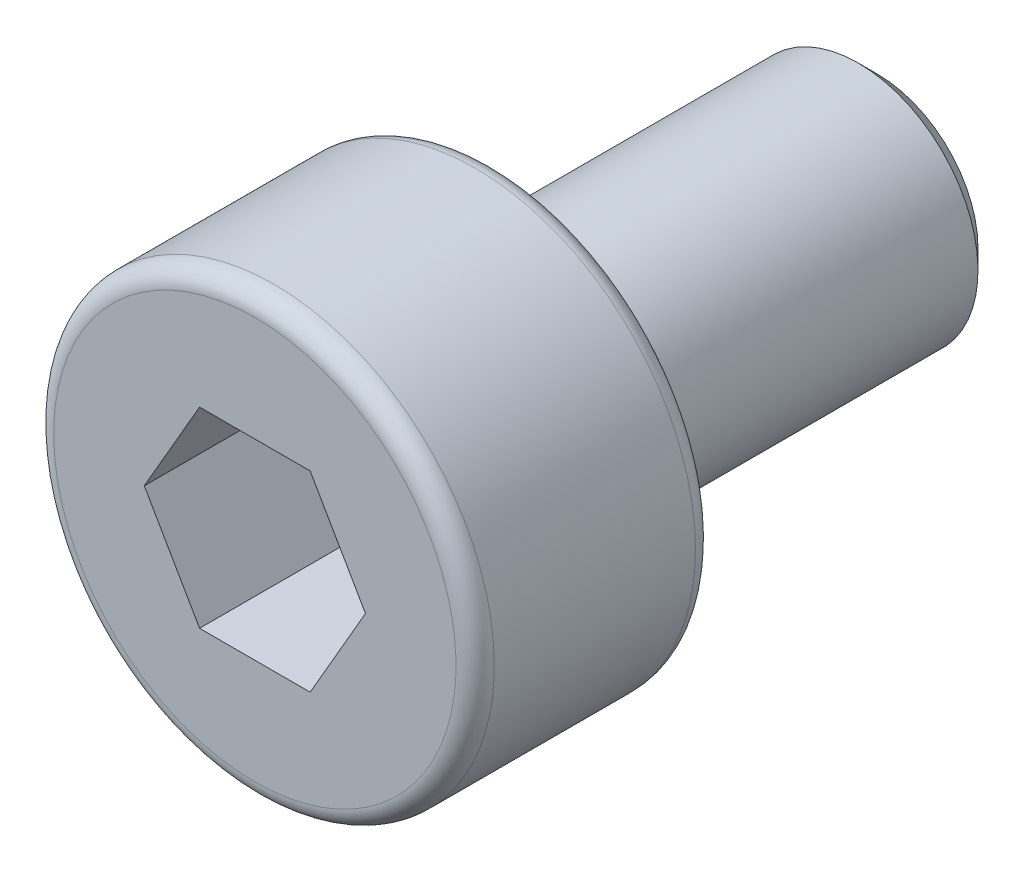
ISO-10303-21;
HEADER;
FILE_DESCRIPTION(('STEP AP214'),'2;1');
FILE_NAME('part.step','',(''),(''),'','','');
FILE_SCHEMA(('AUTOMOTIVE_DESIGN { 1 0 10303 214 1 1 1 1 }'));
ENDSEC;
DATA;
#1=APPLICATION_CONTEXT('core data for automotive mechanical design processes');
#2=APPLICATION_PROTOCOL_DEFINITION('international standard','automotive_design',2000,#1);
#3=PRODUCT_CONTEXT('',#1,'mechanical');
#4=PRODUCT('Part','Part','',(#3));
#5=PRODUCT_RELATED_PRODUCT_CATEGORY('part','',(#4));
#6=PRODUCT_DEFINITION_FORMATION('','',#4);
#7=PRODUCT_DEFINITION_CONTEXT('part definition',#1,'design');
#8=PRODUCT_DEFINITION('design','',#6,#7);
#9=PRODUCT_DEFINITION_SHAPE('','',#8);
#10=(LENGTH_UNIT() NAMED_UNIT(*) SI_UNIT(.MILLI.,.METRE.));
#11=(NAMED_UNIT(*) PLANE_ANGLE_UNIT() SI_UNIT($,.RADIAN.));
#12=(NAMED_UNIT(*) SI_UNIT($,.STERADIAN.) SOLID_ANGLE_UNIT());
#13=UNCERTAINTY_MEASURE_WITH_UNIT(LENGTH_MEASURE(1.E-05),#10,'distance_accuracy_value','');
#14=(GEOMETRIC_REPRESENTATION_CONTEXT(3) GLOBAL_UNCERTAINTY_ASSIGNED_CONTEXT((#13)) GLOBAL_UNIT_ASSIGNED_CONTEXT((#10,
#11,#12)) REPRESENTATION_CONTEXT('',''));
#15=CARTESIAN_POINT('',(0.,0.,0.));
#16=DIRECTION('',(0.,0.,1.));
#17=DIRECTION('',(1.,0.,0.));
#18=AXIS2_PLACEMENT_3D('',#15,#16,#17);
#19=CARTESIAN_POINT('',(0.,0.,0.));
#20=DIRECTION('',(0.,0.,1.));
#21=DIRECTION('',(0.,-1.,0.));
#22=AXIS2_PLACEMENT_3D('',#19,#20,#21);
#23=PLANE('',#22);
#24=DIRECTION('',(0.5,0.866025403784439,0.));
#25=VECTOR('',#24,1.);
#26=CARTESIAN_POINT('',(0.577350269189626,-1.,0.));
#27=LINE('',#26,#25);
#28=CARTESIAN_POINT('',(0.577350269189626,-1.,0.));
#29=VERTEX_POINT('',#28);
#30=CARTESIAN_POINT('',(1.15470053837925,0.,0.));
#31=VERTEX_POINT('',#30);
#32=EDGE_CURVE('E50',#29,#31,#27,.T.);
#33=ORIENTED_EDGE('',*,*,#32,.F.);
#34=DIRECTION('',(1.,0.,0.));
#35=VECTOR('',#34,1.);
#36=CARTESIAN_POINT('',(-0.577350269189626,-1.,0.));
#37=LINE('',#36,#35);
#38=CARTESIAN_POINT('',(-0.577350269189626,-1.,0.));
#39=VERTEX_POINT('',#38);
#40=EDGE_CURVE('E133',#39,#29,#37,.T.);
#41=ORIENTED_EDGE('',*,*,#40,.F.);
#42=DIRECTION('',(0.5,-0.866025403784438,0.));
#43=VECTOR('',#42,1.);
#44=CARTESIAN_POINT('',(-1.15470053837925,0.,0.));
#45=LINE('',#44,#43);
#46=CARTESIAN_POINT('',(-1.15470053837925,0.,0.));
#47=VERTEX_POINT('',#46);
#48=EDGE_CURVE('E131',#47,#39,#45,.T.);
#49=ORIENTED_EDGE('',*,*,#48,.F.);
#50=DIRECTION('',(-0.5,-0.866025403784439,0.));
#51=VECTOR('',#50,1.);
#52=CARTESIAN_POINT('',(-0.577350269189626,1.,0.));
#53=LINE('',#52,#51);
#54=CARTESIAN_POINT('',(-0.577350269189626,1.,0.));
#55=VERTEX_POINT('',#54);
#56=EDGE_CURVE('E98',#55,#47,#53,.T.);
#57=ORIENTED_EDGE('',*,*,#56,.F.);
#58=DIRECTION('',(-1.,0.,0.));
#59=VECTOR('',#58,1.);
#60=CARTESIAN_POINT('',(0.577350269189625,1.,0.));
#61=LINE('',#60,#59);
#62=CARTESIAN_POINT('',(0.577350269189625,1.,0.));
#63=VERTEX_POINT('',#62);
#64=EDGE_CURVE('E127',#63,#55,#61,.T.);
#65=ORIENTED_EDGE('',*,*,#64,.F.);
#66=DIRECTION('',(-0.5,0.866025403784438,0.));
#67=VECTOR('',#66,1.);
#68=CARTESIAN_POINT('',(1.15470053837925,0.,0.));
#69=LINE('',#68,#67);
#70=EDGE_CURVE('E124',#31,#63,#69,.T.);
#71=ORIENTED_EDGE('',*,*,#70,.F.);
#72=EDGE_LOOP('',(#33,#41,#49,#57,#65,#71));
#73=FACE_BOUND('',#72,.T.);
#74=CARTESIAN_POINT('',(0.,0.,0.));
#75=DIRECTION('',(0.,0.,1.));
#76=DIRECTION('',(0.,-1.,0.));
#77=AXIS2_PLACEMENT_3D('',#74,#75,#76);
#78=CIRCLE('',#77,2.1);
#79=CARTESIAN_POINT('',(0.,-2.1,0.));
#80=VERTEX_POINT('',#79);
#81=EDGE_CURVE('E154',#80,#80,#78,.T.);
#82=ORIENTED_EDGE('',*,*,#81,.T.);
#83=EDGE_LOOP('',(#82));
#84=FACE_BOUND('',#83,.T.);
#85=ADVANCED_FACE('F34',(#73,#84),#23,.T.);
#86=CARTESIAN_POINT('',(0.,0.,-6.5));
#87=DIRECTION('',(0.,0.,-1.));
#88=DIRECTION('',(0.,1.,0.));
#89=AXIS2_PLACEMENT_3D('',#86,#87,#88);
#90=CYLINDRICAL_SURFACE('',#89,2.3);
#91=CARTESIAN_POINT('',(0.,0.,-2.3));
#92=DIRECTION('',(0.,0.,-1.));
#93=DIRECTION('',(0.,1.,0.));
#94=AXIS2_PLACEMENT_3D('',#91,#92,#93);
#95=CIRCLE('',#94,2.3);
#96=CARTESIAN_POINT('',(0.,2.3,-2.3));
#97=VERTEX_POINT('',#96);
#98=EDGE_CURVE('E151',#97,#97,#95,.F.);
#99=ORIENTED_EDGE('',*,*,#98,.T.);
#100=EDGE_LOOP('',(#99));
#101=FACE_BOUND('',#100,.T.);
#102=CARTESIAN_POINT('',(0.,0.,-0.2));
#103=DIRECTION('',(0.,0.,1.));
#104=DIRECTION('',(0.,-1.,0.));
#105=AXIS2_PLACEMENT_3D('',#102,#103,#104);
#106=CIRCLE('',#105,2.3);
#107=CARTESIAN_POINT('',(0.,-2.3,-0.2));
#108=VERTEX_POINT('',#107);
#109=EDGE_CURVE('E148',#108,#108,#106,.F.);
#110=ORIENTED_EDGE('',*,*,#109,.T.);
#111=EDGE_LOOP('',(#110));
#112=FACE_BOUND('',#111,.T.);
#113=ADVANCED_FACE('F175',(#101,#112),#90,.T.);
#114=CARTESIAN_POINT('',(0.,2.3,-2.5));
#115=DIRECTION('',(0.,0.,-1.));
#116=DIRECTION('',(0.,1.,0.));
#117=AXIS2_PLACEMENT_3D('',#114,#115,#116);
#118=PLANE('',#117);
#119=CARTESIAN_POINT('',(0.,0.,-2.5));
#120=DIRECTION('',(0.,0.,-1.));
#121=DIRECTION('',(0.,1.,0.));
#122=AXIS2_PLACEMENT_3D('',#119,#120,#121);
#123=CIRCLE('',#122,2.1);
#124=CARTESIAN_POINT('',(0.,2.1,-2.5));
#125=VERTEX_POINT('',#124);
#126=EDGE_CURVE('E145',#125,#125,#123,.T.);
#127=ORIENTED_EDGE('',*,*,#126,.T.);
#128=EDGE_LOOP('',(#127));
#129=FACE_BOUND('',#128,.T.);
#130=CARTESIAN_POINT('',(0.,0.,-2.5));
#131=DIRECTION('',(0.,0.,-1.));
#132=DIRECTION('',(0.,1.,0.));
#133=AXIS2_PLACEMENT_3D('',#130,#131,#132);
#134=CIRCLE('',#133,1.25);
#135=CARTESIAN_POINT('',(0.,1.25,-2.5));
#136=VERTEX_POINT('',#135);
#137=EDGE_CURVE('E137',#136,#136,#134,.T.);
#138=ORIENTED_EDGE('',*,*,#137,.F.);
#139=EDGE_LOOP('',(#138));
#140=FACE_BOUND('',#139,.T.);
#141=ADVANCED_FACE('F181',(#129,#140),#118,.T.);
#142=CARTESIAN_POINT('',(0.,0.,-6.5));
#143=DIRECTION('',(0.,0.,-1.));
#144=DIRECTION('',(0.,1.,0.));
#145=AXIS2_PLACEMENT_3D('',#142,#143,#144);
#146=CYLINDRICAL_SURFACE('',#145,1.25);
#147=CARTESIAN_POINT('',(0.,0.,-6.3));
#148=DIRECTION('',(0.,0.,-1.));
#149=DIRECTION('',(0.,1.,0.));
#150=AXIS2_PLACEMENT_3D('',#147,#148,#149);
#151=CIRCLE('',#150,1.25);
#152=CARTESIAN_POINT('',(0.,1.25,-6.3));
#153=VERTEX_POINT('',#152);
#154=EDGE_CURVE('E11',#153,#153,#151,.F.);
#155=ORIENTED_EDGE('',*,*,#154,.T.);
#156=EDGE_LOOP('',(#155));
#157=FACE_BOUND('',#156,.T.);
#158=ORIENTED_EDGE('',*,*,#137,.T.);
#159=EDGE_LOOP('',(#158));
#160=FACE_BOUND('',#159,.T.);
#161=ADVANCED_FACE('F192',(#157,#160),#146,.T.);
#162=CARTESIAN_POINT('',(0.,1.25,-6.5));
#163=DIRECTION('',(0.,0.,-1.));
#164=DIRECTION('',(0.,1.,0.));
#165=AXIS2_PLACEMENT_3D('',#162,#163,#164);
#166=PLANE('',#165);
#167=CARTESIAN_POINT('',(0.,0.,-6.5));
#168=DIRECTION('',(0.,0.,-1.));
#169=DIRECTION('',(0.,1.,0.));
#170=AXIS2_PLACEMENT_3D('',#167,#168,#169);
#171=CIRCLE('',#170,1.05);
#172=CARTESIAN_POINT('',(0.,1.05,-6.5));
#173=VERTEX_POINT('',#172);
#174=EDGE_CURVE('E43',#173,#173,#171,.T.);
#175=ORIENTED_EDGE('',*,*,#174,.T.);
#176=EDGE_LOOP('',(#175));
#177=FACE_BOUND('',#176,.T.);
#178=ADVANCED_FACE('F159',(#177),#166,.T.);
#179=CARTESIAN_POINT('',(0.,0.,-2.3));
#180=DIRECTION('',(0.,0.,-1.));
#181=DIRECTION('',(0.,1.,0.));
#182=AXIS2_PLACEMENT_3D('',#179,#180,#181);
#183=TOROIDAL_SURFACE('',#182,2.1,0.2);
#184=ORIENTED_EDGE('',*,*,#98,.F.);
#185=EDGE_LOOP('',(#184));
#186=FACE_BOUND('',#185,.T.);
#187=ORIENTED_EDGE('',*,*,#126,.F.);
#188=EDGE_LOOP('',(#187));
#189=FACE_BOUND('',#188,.T.);
#190=ADVANCED_FACE('F171',(#186,#189),#183,.T.);
#191=CARTESIAN_POINT('',(0.,0.,-0.2));
#192=DIRECTION('',(0.,0.,1.));
#193=DIRECTION('',(0.,-1.,0.));
#194=AXIS2_PLACEMENT_3D('',#191,#192,#193);
#195=TOROIDAL_SURFACE('',#194,2.1,0.2);
#196=ORIENTED_EDGE('',*,*,#81,.F.);
#197=EDGE_LOOP('',(#196));
#198=FACE_BOUND('',#197,.T.);
#199=ORIENTED_EDGE('',*,*,#109,.F.);
#200=EDGE_LOOP('',(#199));
#201=FACE_BOUND('',#200,.T.);
#202=ADVANCED_FACE('F163',(#198,#201),#195,.T.);
#203=CARTESIAN_POINT('',(0.,0.,-6.5));
#204=DIRECTION('',(0.,0.,1.));
#205=DIRECTION('',(0.,-1.,0.));
#206=AXIS2_PLACEMENT_3D('',#203,#204,#205);
#207=CONICAL_SURFACE('',#206,1.05,0.785398163397446);
#208=ORIENTED_EDGE('',*,*,#154,.F.);
#209=EDGE_LOOP('',(#208));
#210=FACE_BOUND('',#209,.T.);
#211=ORIENTED_EDGE('',*,*,#174,.F.);
#212=EDGE_LOOP('',(#211));
#213=FACE_BOUND('',#212,.T.);
#214=ADVANCED_FACE('F37',(#210,#213),#207,.T.);
#215=CARTESIAN_POINT('',(0.577350269189626,-1.,-1.5));
#216=DIRECTION('',(0.866025403784439,-0.5,0.));
#217=DIRECTION('',(0.5,0.866025403784439,0.));
#218=AXIS2_PLACEMENT_3D('',#215,#216,#217);
#219=PLANE('',#218);
#220=ORIENTED_EDGE('',*,*,#32,.T.);
#221=DIRECTION('',(0.,0.,1.));
#222=VECTOR('',#221,1.);
#223=CARTESIAN_POINT('',(1.15470053837925,0.,-1.5));
#224=LINE('',#223,#222);
#225=CARTESIAN_POINT('',(1.15470053837925,0.,-1.5));
#226=VERTEX_POINT('',#225);
#227=EDGE_CURVE('E80',#226,#31,#224,.T.);
#228=ORIENTED_EDGE('',*,*,#227,.F.);
#229=DIRECTION('',(0.5,0.866025403784439,0.));
#230=VECTOR('',#229,1.);
#231=CARTESIAN_POINT('',(0.577350269189626,-1.,-1.5));
#232=LINE('',#231,#230);
#233=CARTESIAN_POINT('',(0.577350269189626,-1.,-1.5));
#234=VERTEX_POINT('',#233);
#235=EDGE_CURVE('E135',#234,#226,#232,.T.);
#236=ORIENTED_EDGE('',*,*,#235,.F.);
#237=DIRECTION('',(0.,0.,1.));
#238=VECTOR('',#237,1.);
#239=CARTESIAN_POINT('',(0.577350269189626,-1.,-1.5));
#240=LINE('',#239,#238);
#241=EDGE_CURVE('E58',#234,#29,#240,.T.);
#242=ORIENTED_EDGE('',*,*,#241,.T.);
#243=EDGE_LOOP('',(#220,#228,#236,#242));
#244=FACE_BOUND('',#243,.T.);
#245=ADVANCED_FACE('F162',(#244),#219,.F.);
#246=CARTESIAN_POINT('',(-0.577350269189626,-1.,-1.5));
#247=DIRECTION('',(0.,-1.,0.));
#248=DIRECTION('',(0.,0.,-1.));
#249=AXIS2_PLACEMENT_3D('',#246,#247,#248);
#250=PLANE('',#249);
#251=ORIENTED_EDGE('',*,*,#40,.T.);
#252=ORIENTED_EDGE('',*,*,#241,.F.);
#253=DIRECTION('',(1.,0.,0.));
#254=VECTOR('',#253,1.);
#255=CARTESIAN_POINT('',(-0.577350269189626,-1.,-1.5));
#256=LINE('',#255,#254);
#257=CARTESIAN_POINT('',(-0.577350269189626,-1.,-1.5));
#258=VERTEX_POINT('',#257);
#259=EDGE_CURVE('E110',#258,#234,#256,.T.);
#260=ORIENTED_EDGE('',*,*,#259,.F.);
#261=DIRECTION('',(0.,0.,1.));
#262=VECTOR('',#261,1.);
#263=CARTESIAN_POINT('',(-0.577350269189626,-1.,-1.5));
#264=LINE('',#263,#262);
#265=EDGE_CURVE('E102',#258,#39,#264,.T.);
#266=ORIENTED_EDGE('',*,*,#265,.T.);
#267=EDGE_LOOP('',(#251,#252,#260,#266));
#268=FACE_BOUND('',#267,.T.);
#269=ADVANCED_FACE('F169',(#268),#250,.F.);
#270=CARTESIAN_POINT('',(-1.15470053837925,0.,-1.5));
#271=DIRECTION('',(-0.866025403784438,-0.5,0.));
#272=DIRECTION('',(0.5,-0.866025403784438,0.));
#273=AXIS2_PLACEMENT_3D('',#270,#271,#272);
#274=PLANE('',#273);
#275=ORIENTED_EDGE('',*,*,#48,.T.);
#276=ORIENTED_EDGE('',*,*,#265,.F.);
#277=DIRECTION('',(0.5,-0.866025403784438,0.));
#278=VECTOR('',#277,1.);
#279=CARTESIAN_POINT('',(-1.15470053837925,0.,-1.5));
#280=LINE('',#279,#278);
#281=CARTESIAN_POINT('',(-1.15470053837925,0.,-1.5));
#282=VERTEX_POINT('',#281);
#283=EDGE_CURVE('E106',#282,#258,#280,.T.);
#284=ORIENTED_EDGE('',*,*,#283,.F.);
#285=DIRECTION('',(0.,0.,1.));
#286=VECTOR('',#285,1.);
#287=CARTESIAN_POINT('',(-1.15470053837925,0.,-1.5));
#288=LINE('',#287,#286);
#289=EDGE_CURVE('E91',#282,#47,#288,.T.);
#290=ORIENTED_EDGE('',*,*,#289,.T.);
#291=EDGE_LOOP('',(#275,#276,#284,#290));
#292=FACE_BOUND('',#291,.T.);
#293=ADVANCED_FACE('F107',(#292),#274,.F.);
#294=CARTESIAN_POINT('',(-0.577350269189626,1.,-1.5));
#295=DIRECTION('',(-0.866025403784439,0.5,0.));
#296=DIRECTION('',(-0.5,-0.866025403784439,0.));
#297=AXIS2_PLACEMENT_3D('',#294,#295,#296);
#298=PLANE('',#297);
#299=ORIENTED_EDGE('',*,*,#56,.T.);
#300=ORIENTED_EDGE('',*,*,#289,.F.);
#301=DIRECTION('',(-0.5,-0.866025403784439,0.));
#302=VECTOR('',#301,1.);
#303=CARTESIAN_POINT('',(-0.577350269189626,1.,-1.5));
#304=LINE('',#303,#302);
#305=CARTESIAN_POINT('',(-0.577350269189626,1.,-1.5));
#306=VERTEX_POINT('',#305);
#307=EDGE_CURVE('E95',#306,#282,#304,.T.);
#308=ORIENTED_EDGE('',*,*,#307,.F.);
#309=DIRECTION('',(0.,0.,1.));
#310=VECTOR('',#309,1.);
#311=CARTESIAN_POINT('',(-0.577350269189626,1.,-1.5));
#312=LINE('',#311,#310);
#313=EDGE_CURVE('E103',#306,#55,#312,.T.);
#314=ORIENTED_EDGE('',*,*,#313,.T.);
#315=EDGE_LOOP('',(#299,#300,#308,#314));
#316=FACE_BOUND('',#315,.T.);
#317=ADVANCED_FACE('F93',(#316),#298,.F.);
#318=CARTESIAN_POINT('',(0.577350269189625,1.,-1.5));
#319=DIRECTION('',(0.,1.,0.));
#320=DIRECTION('',(0.,0.,1.));
#321=AXIS2_PLACEMENT_3D('',#318,#319,#320);
#322=PLANE('',#321);
#323=ORIENTED_EDGE('',*,*,#64,.T.);
#324=ORIENTED_EDGE('',*,*,#313,.F.);
#325=DIRECTION('',(-1.,0.,0.));
#326=VECTOR('',#325,1.);
#327=CARTESIAN_POINT('',(0.577350269189625,1.,-1.5));
#328=LINE('',#327,#326);
#329=CARTESIAN_POINT('',(0.577350269189625,1.,-1.5));
#330=VERTEX_POINT('',#329);
#331=EDGE_CURVE('E116',#330,#306,#328,.T.);
#332=ORIENTED_EDGE('',*,*,#331,.F.);
#333=DIRECTION('',(0.,0.,1.));
#334=VECTOR('',#333,1.);
#335=CARTESIAN_POINT('',(0.577350269189625,1.,-1.5));
#336=LINE('',#335,#334);
#337=EDGE_CURVE('E140',#330,#63,#336,.T.);
#338=ORIENTED_EDGE('',*,*,#337,.T.);
#339=EDGE_LOOP('',(#323,#324,#332,#338));
#340=FACE_BOUND('',#339,.T.);
#341=ADVANCED_FACE('F211',(#340),#322,.F.);
#342=CARTESIAN_POINT('',(1.15470053837925,0.,-1.5));
#343=DIRECTION('',(0.866025403784439,0.5,0.));
#344=DIRECTION('',(-0.5,0.866025403784439,0.));
#345=AXIS2_PLACEMENT_3D('',#342,#343,#344);
#346=PLANE('',#345);
#347=ORIENTED_EDGE('',*,*,#70,.T.);
#348=ORIENTED_EDGE('',*,*,#337,.F.);
#349=DIRECTION('',(-0.5,0.866025403784438,0.));
#350=VECTOR('',#349,1.);
#351=CARTESIAN_POINT('',(1.15470053837925,0.,-1.5));
#352=LINE('',#351,#350);
#353=EDGE_CURVE('E118',#226,#330,#352,.T.);
#354=ORIENTED_EDGE('',*,*,#353,.F.);
#355=ORIENTED_EDGE('',*,*,#227,.T.);
#356=EDGE_LOOP('',(#347,#348,#354,#355));
#357=FACE_BOUND('',#356,.T.);
#358=ADVANCED_FACE('F208',(#357),#346,.F.);
#359=CARTESIAN_POINT('',(0.,0.,-1.5));
#360=DIRECTION('',(0.,0.,1.));
#361=DIRECTION('',(1.,0.,0.));
#362=AXIS2_PLACEMENT_3D('',#359,#360,#361);
#363=PLANE('',#362);
#364=ORIENTED_EDGE('',*,*,#235,.T.);
#365=ORIENTED_EDGE('',*,*,#353,.T.);
#366=ORIENTED_EDGE('',*,*,#331,.T.);
#367=ORIENTED_EDGE('',*,*,#307,.T.);
#368=ORIENTED_EDGE('',*,*,#283,.T.);
#369=ORIENTED_EDGE('',*,*,#259,.T.);
#370=EDGE_LOOP('',(#364,#365,#366,#367,#368,#369));
#371=FACE_BOUND('',#370,.T.);
#372=ADVANCED_FACE('F113',(#371),#363,.T.);
#373=CLOSED_SHELL('',(#85,#113,#141,#161,#178,#190,#202,#214,#245,#269,#293,#317,#341,#358,#372));
#374=MANIFOLD_SOLID_BREP('B2',#373);
#375=ADVANCED_BREP_SHAPE_REPRESENTATION('',(#18,#374),#14);
#376=SHAPE_DEFINITION_REPRESENTATION(#9,#375);
ENDSEC;
END-ISO-10303-21;
